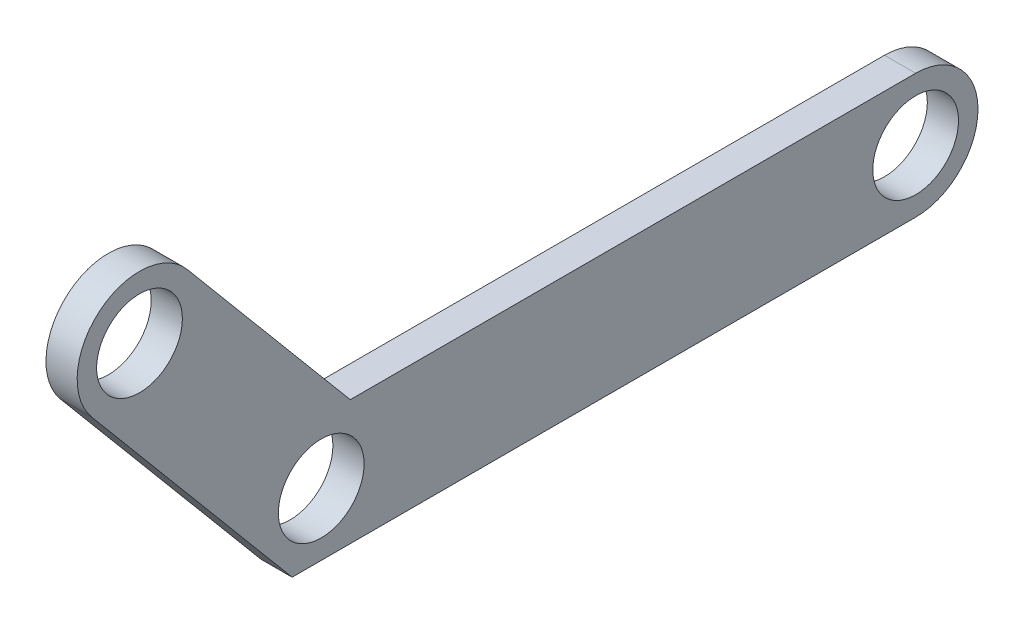
ISO-10303-21;
HEADER;
FILE_DESCRIPTION(('STEP AP214'),'2;1');
FILE_NAME('part.step','',(''),(''),'','','');
FILE_SCHEMA(('AUTOMOTIVE_DESIGN { 1 0 10303 214 1 1 1 1 }'));
ENDSEC;
DATA;
#1=APPLICATION_CONTEXT('core data for automotive mechanical design processes');
#2=APPLICATION_PROTOCOL_DEFINITION('international standard','automotive_design',2000,#1);
#3=PRODUCT_CONTEXT('',#1,'mechanical');
#4=PRODUCT('Part','Part','',(#3));
#5=PRODUCT_RELATED_PRODUCT_CATEGORY('part','',(#4));
#6=PRODUCT_DEFINITION_FORMATION('','',#4);
#7=PRODUCT_DEFINITION_CONTEXT('part definition',#1,'design');
#8=PRODUCT_DEFINITION('design','',#6,#7);
#9=PRODUCT_DEFINITION_SHAPE('','',#8);
#10=(LENGTH_UNIT() NAMED_UNIT(*) SI_UNIT(.MILLI.,.METRE.));
#11=(NAMED_UNIT(*) PLANE_ANGLE_UNIT() SI_UNIT($,.RADIAN.));
#12=(NAMED_UNIT(*) SI_UNIT($,.STERADIAN.) SOLID_ANGLE_UNIT());
#13=UNCERTAINTY_MEASURE_WITH_UNIT(LENGTH_MEASURE(1.E-05),#10,'distance_accuracy_value','');
#14=(GEOMETRIC_REPRESENTATION_CONTEXT(3) GLOBAL_UNCERTAINTY_ASSIGNED_CONTEXT((#13)) GLOBAL_UNIT_ASSIGNED_CONTEXT((#10,
#11,#12)) REPRESENTATION_CONTEXT('',''));
#15=CARTESIAN_POINT('',(0.,0.,0.));
#16=DIRECTION('',(0.,0.,1.));
#17=DIRECTION('',(1.,0.,0.));
#18=AXIS2_PLACEMENT_3D('',#15,#16,#17);
#19=CARTESIAN_POINT('',(2.,4.,-40.));
#20=DIRECTION('',(1.,0.,0.));
#21=DIRECTION('',(0.,0.,-1.));
#22=AXIS2_PLACEMENT_3D('',#19,#20,#21);
#23=PLANE('',#22);
#24=CARTESIAN_POINT('',(2.,4.,-40.));
#25=DIRECTION('',(1.,0.,0.));
#26=DIRECTION('',(0.,0.,-1.));
#27=AXIS2_PLACEMENT_3D('',#24,#25,#26);
#28=CIRCLE('',#27,2.75);
#29=CARTESIAN_POINT('',(2.,4.,-42.75));
#30=VERTEX_POINT('',#29);
#31=EDGE_CURVE('E194',#30,#30,#28,.T.);
#32=ORIENTED_EDGE('',*,*,#31,.F.);
#33=EDGE_LOOP('',(#32));
#34=FACE_BOUND('',#33,.T.);
#35=DIRECTION('',(0.,0.,-1.));
#36=VECTOR('',#35,1.);
#37=CARTESIAN_POINT('',(2.,0.,0.));
#38=LINE('',#37,#36);
#39=CARTESIAN_POINT('',(2.,0.,0.));
#40=VERTEX_POINT('',#39);
#41=CARTESIAN_POINT('',(2.,0.,-40.));
#42=VERTEX_POINT('',#41);
#43=EDGE_CURVE('E139',#40,#42,#38,.T.);
#44=ORIENTED_EDGE('',*,*,#43,.T.);
#45=CARTESIAN_POINT('',(2.,4.,-40.));
#46=DIRECTION('',(1.,0.,0.));
#47=DIRECTION('',(0.,0.,-1.));
#48=AXIS2_PLACEMENT_3D('',#45,#46,#47);
#49=CIRCLE('',#48,4.);
#50=CARTESIAN_POINT('',(2.,8.,-40.));
#51=VERTEX_POINT('',#50);
#52=EDGE_CURVE('E97',#42,#51,#49,.T.);
#53=ORIENTED_EDGE('',*,*,#52,.T.);
#54=DIRECTION('',(0.,0.,1.));
#55=VECTOR('',#54,1.);
#56=CARTESIAN_POINT('',(2.,8.,-3.73046126524));
#57=LINE('',#56,#55);
#58=CARTESIAN_POINT('',(2.,8.,-3.73046126524));
#59=VERTEX_POINT('',#58);
#60=EDGE_CURVE('E110',#51,#59,#57,.T.);
#61=ORIENTED_EDGE('',*,*,#60,.T.);
#62=DIRECTION('',(0.,0.766044443118979,0.642787609686538));
#63=VECTOR('',#62,1.);
#64=CARTESIAN_POINT('',(2.,20.4631897398719,6.72739664877892));
#65=LINE('',#64,#63);
#66=CARTESIAN_POINT('',(2.,20.4631897398719,6.72739664877892));
#67=VERTEX_POINT('',#66);
#68=EDGE_CURVE('E104',#59,#67,#65,.T.);
#69=ORIENTED_EDGE('',*,*,#68,.T.);
#70=CARTESIAN_POINT('',(2.,17.8920393011257,9.79157442125484));
#71=DIRECTION('',(1.,0.,0.));
#72=DIRECTION('',(0.,0.,-1.));
#73=AXIS2_PLACEMENT_3D('',#70,#71,#72);
#74=CIRCLE('',#73,4.);
#75=CARTESIAN_POINT('',(2.,15.3208888623796,12.8557521937308));
#76=VERTEX_POINT('',#75);
#77=EDGE_CURVE('E108',#67,#76,#74,.T.);
#78=ORIENTED_EDGE('',*,*,#77,.T.);
#79=DIRECTION('',(0.,-0.766044443118979,-0.642787609686538));
#80=VECTOR('',#79,1.);
#81=CARTESIAN_POINT('',(2.,0.,0.));
#82=LINE('',#81,#80);
#83=EDGE_CURVE('E60',#76,#40,#82,.T.);
#84=ORIENTED_EDGE('',*,*,#83,.T.);
#85=EDGE_LOOP('',(#44,#53,#61,#69,#78,#84));
#86=FACE_BOUND('',#85,.T.);
#87=CARTESIAN_POINT('',(2.,17.8920393011257,9.79157442125484));
#88=DIRECTION('',(1.,0.,0.));
#89=DIRECTION('',(0.,0.,-1.));
#90=AXIS2_PLACEMENT_3D('',#87,#88,#89);
#91=CIRCLE('',#90,2.75);
#92=CARTESIAN_POINT('',(2.,17.8920393011257,7.04157442125484));
#93=VERTEX_POINT('',#92);
#94=EDGE_CURVE('E132',#93,#93,#91,.T.);
#95=ORIENTED_EDGE('',*,*,#94,.F.);
#96=EDGE_LOOP('',(#95));
#97=FACE_BOUND('',#96,.T.);
#98=CARTESIAN_POINT('',(2.,4.,-1.86523063262));
#99=DIRECTION('',(1.,0.,0.));
#100=DIRECTION('',(0.,0.,-1.));
#101=AXIS2_PLACEMENT_3D('',#98,#99,#100);
#102=CIRCLE('',#101,2.75);
#103=CARTESIAN_POINT('',(2.,4.,-4.61523063262));
#104=VERTEX_POINT('',#103);
#105=EDGE_CURVE('E185',#104,#104,#102,.T.);
#106=ORIENTED_EDGE('',*,*,#105,.F.);
#107=EDGE_LOOP('',(#106));
#108=FACE_BOUND('',#107,.T.);
#109=ADVANCED_FACE('F43',(#34,#86,#97,#108),#23,.T.);
#110=CARTESIAN_POINT('',(0.,4.,-40.));
#111=DIRECTION('',(1.,0.,0.));
#112=DIRECTION('',(0.,0.,-1.));
#113=AXIS2_PLACEMENT_3D('',#110,#111,#112);
#114=PLANE('',#113);
#115=DIRECTION('',(0.,0.,-1.));
#116=VECTOR('',#115,1.);
#117=CARTESIAN_POINT('',(0.,0.,0.));
#118=LINE('',#117,#116);
#119=CARTESIAN_POINT('',(0.,0.,0.));
#120=VERTEX_POINT('',#119);
#121=CARTESIAN_POINT('',(0.,0.,-40.));
#122=VERTEX_POINT('',#121);
#123=EDGE_CURVE('E128',#120,#122,#118,.T.);
#124=ORIENTED_EDGE('',*,*,#123,.F.);
#125=DIRECTION('',(0.,-0.766044443118979,-0.642787609686538));
#126=VECTOR('',#125,1.);
#127=CARTESIAN_POINT('',(0.,0.,0.));
#128=LINE('',#127,#126);
#129=CARTESIAN_POINT('',(0.,15.3208888623796,12.8557521937308));
#130=VERTEX_POINT('',#129);
#131=EDGE_CURVE('E89',#130,#120,#128,.T.);
#132=ORIENTED_EDGE('',*,*,#131,.F.);
#133=CARTESIAN_POINT('',(0.,17.8920393011257,9.79157442125484));
#134=DIRECTION('',(1.,0.,0.));
#135=DIRECTION('',(0.,0.,-1.));
#136=AXIS2_PLACEMENT_3D('',#133,#134,#135);
#137=CIRCLE('',#136,4.);
#138=CARTESIAN_POINT('',(0.,20.4631897398719,6.72739664877892));
#139=VERTEX_POINT('',#138);
#140=EDGE_CURVE('E83',#139,#130,#137,.T.);
#141=ORIENTED_EDGE('',*,*,#140,.F.);
#142=DIRECTION('',(0.,0.766044443118979,0.642787609686538));
#143=VECTOR('',#142,1.);
#144=CARTESIAN_POINT('',(0.,20.4631897398719,6.72739664877892));
#145=LINE('',#144,#143);
#146=CARTESIAN_POINT('',(0.,8.,-3.73046126524));
#147=VERTEX_POINT('',#146);
#148=EDGE_CURVE('E118',#147,#139,#145,.T.);
#149=ORIENTED_EDGE('',*,*,#148,.F.);
#150=DIRECTION('',(0.,0.,1.));
#151=VECTOR('',#150,1.);
#152=CARTESIAN_POINT('',(0.,8.,-3.73046126524));
#153=LINE('',#152,#151);
#154=CARTESIAN_POINT('',(0.,8.,-40.));
#155=VERTEX_POINT('',#154);
#156=EDGE_CURVE('E134',#155,#147,#153,.T.);
#157=ORIENTED_EDGE('',*,*,#156,.F.);
#158=CARTESIAN_POINT('',(0.,4.,-40.));
#159=DIRECTION('',(1.,0.,0.));
#160=DIRECTION('',(0.,0.,-1.));
#161=AXIS2_PLACEMENT_3D('',#158,#159,#160);
#162=CIRCLE('',#161,4.);
#163=EDGE_CURVE('E131',#122,#155,#162,.T.);
#164=ORIENTED_EDGE('',*,*,#163,.F.);
#165=EDGE_LOOP('',(#124,#132,#141,#149,#157,#164));
#166=FACE_BOUND('',#165,.T.);
#167=CARTESIAN_POINT('',(0.,17.8920393011257,9.79157442125484));
#168=DIRECTION('',(1.,0.,0.));
#169=DIRECTION('',(0.,0.,-1.));
#170=AXIS2_PLACEMENT_3D('',#167,#168,#169);
#171=CIRCLE('',#170,2.75);
#172=CARTESIAN_POINT('',(0.,17.8920393011257,7.04157442125484));
#173=VERTEX_POINT('',#172);
#174=EDGE_CURVE('E197',#173,#173,#171,.T.);
#175=ORIENTED_EDGE('',*,*,#174,.T.);
#176=EDGE_LOOP('',(#175));
#177=FACE_BOUND('',#176,.T.);
#178=CARTESIAN_POINT('',(0.,4.,-40.));
#179=DIRECTION('',(1.,0.,0.));
#180=DIRECTION('',(0.,0.,-1.));
#181=AXIS2_PLACEMENT_3D('',#178,#179,#180);
#182=CIRCLE('',#181,2.75);
#183=CARTESIAN_POINT('',(0.,4.,-42.75));
#184=VERTEX_POINT('',#183);
#185=EDGE_CURVE('E191',#184,#184,#182,.T.);
#186=ORIENTED_EDGE('',*,*,#185,.T.);
#187=EDGE_LOOP('',(#186));
#188=FACE_BOUND('',#187,.T.);
#189=CARTESIAN_POINT('',(0.,4.,-1.86523063262));
#190=DIRECTION('',(1.,0.,0.));
#191=DIRECTION('',(0.,0.,-1.));
#192=AXIS2_PLACEMENT_3D('',#189,#190,#191);
#193=CIRCLE('',#192,2.75);
#194=CARTESIAN_POINT('',(0.,4.,-4.61523063262));
#195=VERTEX_POINT('',#194);
#196=EDGE_CURVE('E188',#195,#195,#193,.T.);
#197=ORIENTED_EDGE('',*,*,#196,.T.);
#198=EDGE_LOOP('',(#197));
#199=FACE_BOUND('',#198,.T.);
#200=ADVANCED_FACE('F148',(#166,#177,#188,#199),#114,.F.);
#201=CARTESIAN_POINT('',(2.,0.,0.));
#202=DIRECTION('',(0.,1.,0.));
#203=DIRECTION('',(0.,0.,1.));
#204=AXIS2_PLACEMENT_3D('',#201,#202,#203);
#205=PLANE('',#204);
#206=ORIENTED_EDGE('',*,*,#123,.T.);
#207=DIRECTION('',(-1.,0.,0.));
#208=VECTOR('',#207,1.);
#209=CARTESIAN_POINT('',(2.,0.,-40.));
#210=LINE('',#209,#208);
#211=EDGE_CURVE('E11',#42,#122,#210,.T.);
#212=ORIENTED_EDGE('',*,*,#211,.F.);
#213=ORIENTED_EDGE('',*,*,#43,.F.);
#214=DIRECTION('',(-1.,0.,0.));
#215=VECTOR('',#214,1.);
#216=CARTESIAN_POINT('',(2.,0.,0.));
#217=LINE('',#216,#215);
#218=EDGE_CURVE('E124',#40,#120,#217,.T.);
#219=ORIENTED_EDGE('',*,*,#218,.T.);
#220=EDGE_LOOP('',(#206,#212,#213,#219));
#221=FACE_BOUND('',#220,.T.);
#222=ADVANCED_FACE('F45',(#221),#205,.F.);
#223=CARTESIAN_POINT('',(2.,4.,-40.));
#224=DIRECTION('',(-1.,0.,0.));
#225=DIRECTION('',(0.,0.,1.));
#226=AXIS2_PLACEMENT_3D('',#223,#224,#225);
#227=CYLINDRICAL_SURFACE('',#226,4.);
#228=ORIENTED_EDGE('',*,*,#163,.T.);
#229=DIRECTION('',(-1.,0.,0.));
#230=VECTOR('',#229,1.);
#231=CARTESIAN_POINT('',(2.,8.,-40.));
#232=LINE('',#231,#230);
#233=EDGE_CURVE('E52',#51,#155,#232,.T.);
#234=ORIENTED_EDGE('',*,*,#233,.F.);
#235=ORIENTED_EDGE('',*,*,#52,.F.);
#236=ORIENTED_EDGE('',*,*,#211,.T.);
#237=EDGE_LOOP('',(#228,#234,#235,#236));
#238=FACE_BOUND('',#237,.T.);
#239=ADVANCED_FACE('F250',(#238),#227,.T.);
#240=CARTESIAN_POINT('',(2.,8.,-3.73046126524));
#241=DIRECTION('',(0.,-1.,0.));
#242=DIRECTION('',(0.,0.,-1.));
#243=AXIS2_PLACEMENT_3D('',#240,#241,#242);
#244=PLANE('',#243);
#245=ORIENTED_EDGE('',*,*,#156,.T.);
#246=DIRECTION('',(-1.,0.,0.));
#247=VECTOR('',#246,1.);
#248=CARTESIAN_POINT('',(2.,8.,-3.73046126524));
#249=LINE('',#248,#247);
#250=EDGE_CURVE('E119',#59,#147,#249,.T.);
#251=ORIENTED_EDGE('',*,*,#250,.F.);
#252=ORIENTED_EDGE('',*,*,#60,.F.);
#253=ORIENTED_EDGE('',*,*,#233,.T.);
#254=EDGE_LOOP('',(#245,#251,#252,#253));
#255=FACE_BOUND('',#254,.T.);
#256=ADVANCED_FACE('F145',(#255),#244,.F.);
#257=CARTESIAN_POINT('',(2.,20.4631897398719,6.72739664877892));
#258=DIRECTION('',(0.,-0.642787609686538,0.766044443118979));
#259=DIRECTION('',(0.,-0.766044443118979,-0.642787609686538));
#260=AXIS2_PLACEMENT_3D('',#257,#258,#259);
#261=PLANE('',#260);
#262=ORIENTED_EDGE('',*,*,#148,.T.);
#263=DIRECTION('',(-1.,0.,0.));
#264=VECTOR('',#263,1.);
#265=CARTESIAN_POINT('',(2.,20.4631897398719,6.72739664877892));
#266=LINE('',#265,#264);
#267=EDGE_CURVE('E115',#67,#139,#266,.T.);
#268=ORIENTED_EDGE('',*,*,#267,.F.);
#269=ORIENTED_EDGE('',*,*,#68,.F.);
#270=ORIENTED_EDGE('',*,*,#250,.T.);
#271=EDGE_LOOP('',(#262,#268,#269,#270));
#272=FACE_BOUND('',#271,.T.);
#273=ADVANCED_FACE('F116',(#272),#261,.F.);
#274=CARTESIAN_POINT('',(2.,17.8920393011257,9.79157442125484));
#275=DIRECTION('',(-1.,0.,0.));
#276=DIRECTION('',(0.,0.,1.));
#277=AXIS2_PLACEMENT_3D('',#274,#275,#276);
#278=CYLINDRICAL_SURFACE('',#277,4.);
#279=ORIENTED_EDGE('',*,*,#140,.T.);
#280=DIRECTION('',(-1.,0.,0.));
#281=VECTOR('',#280,1.);
#282=CARTESIAN_POINT('',(2.,15.3208888623796,12.8557521937308));
#283=LINE('',#282,#281);
#284=EDGE_CURVE('E120',#76,#130,#283,.T.);
#285=ORIENTED_EDGE('',*,*,#284,.F.);
#286=ORIENTED_EDGE('',*,*,#77,.F.);
#287=ORIENTED_EDGE('',*,*,#267,.T.);
#288=EDGE_LOOP('',(#279,#285,#286,#287));
#289=FACE_BOUND('',#288,.T.);
#290=ADVANCED_FACE('F122',(#289),#278,.T.);
#291=CARTESIAN_POINT('',(2.,0.,0.));
#292=DIRECTION('',(0.,0.642787609686538,-0.766044443118979));
#293=DIRECTION('',(0.,0.766044443118979,0.642787609686538));
#294=AXIS2_PLACEMENT_3D('',#291,#292,#293);
#295=PLANE('',#294);
#296=ORIENTED_EDGE('',*,*,#131,.T.);
#297=ORIENTED_EDGE('',*,*,#218,.F.);
#298=ORIENTED_EDGE('',*,*,#83,.F.);
#299=ORIENTED_EDGE('',*,*,#284,.T.);
#300=EDGE_LOOP('',(#296,#297,#298,#299));
#301=FACE_BOUND('',#300,.T.);
#302=ADVANCED_FACE('F153',(#301),#295,.F.);
#303=CARTESIAN_POINT('',(2.,17.8920393011257,9.79157442125484));
#304=DIRECTION('',(-1.,0.,0.));
#305=DIRECTION('',(0.,0.,1.));
#306=AXIS2_PLACEMENT_3D('',#303,#304,#305);
#307=CYLINDRICAL_SURFACE('',#306,2.75);
#308=ORIENTED_EDGE('',*,*,#94,.T.);
#309=EDGE_LOOP('',(#308));
#310=FACE_BOUND('',#309,.T.);
#311=ORIENTED_EDGE('',*,*,#174,.F.);
#312=EDGE_LOOP('',(#311));
#313=FACE_BOUND('',#312,.T.);
#314=ADVANCED_FACE('F155',(#310,#313),#307,.F.);
#315=CARTESIAN_POINT('',(2.,4.,-40.));
#316=DIRECTION('',(-1.,0.,0.));
#317=DIRECTION('',(0.,0.,1.));
#318=AXIS2_PLACEMENT_3D('',#315,#316,#317);
#319=CYLINDRICAL_SURFACE('',#318,2.75);
#320=ORIENTED_EDGE('',*,*,#31,.T.);
#321=EDGE_LOOP('',(#320));
#322=FACE_BOUND('',#321,.T.);
#323=ORIENTED_EDGE('',*,*,#185,.F.);
#324=EDGE_LOOP('',(#323));
#325=FACE_BOUND('',#324,.T.);
#326=ADVANCED_FACE('F161',(#322,#325),#319,.F.);
#327=CARTESIAN_POINT('',(2.,4.,-1.86523063262));
#328=DIRECTION('',(-1.,0.,0.));
#329=DIRECTION('',(0.,0.,1.));
#330=AXIS2_PLACEMENT_3D('',#327,#328,#329);
#331=CYLINDRICAL_SURFACE('',#330,2.75);
#332=ORIENTED_EDGE('',*,*,#105,.T.);
#333=EDGE_LOOP('',(#332));
#334=FACE_BOUND('',#333,.T.);
#335=ORIENTED_EDGE('',*,*,#196,.F.);
#336=EDGE_LOOP('',(#335));
#337=FACE_BOUND('',#336,.T.);
#338=ADVANCED_FACE('F176',(#334,#337),#331,.F.);
#339=CLOSED_SHELL('',(#109,#200,#222,#239,#256,#273,#290,#302,#314,#326,#338));
#340=MANIFOLD_SOLID_BREP('B2',#339);
#341=ADVANCED_BREP_SHAPE_REPRESENTATION('',(#18,#340),#14);
#342=SHAPE_DEFINITION_REPRESENTATION(#9,#341);
ENDSEC;
END-ISO-10303-21;
